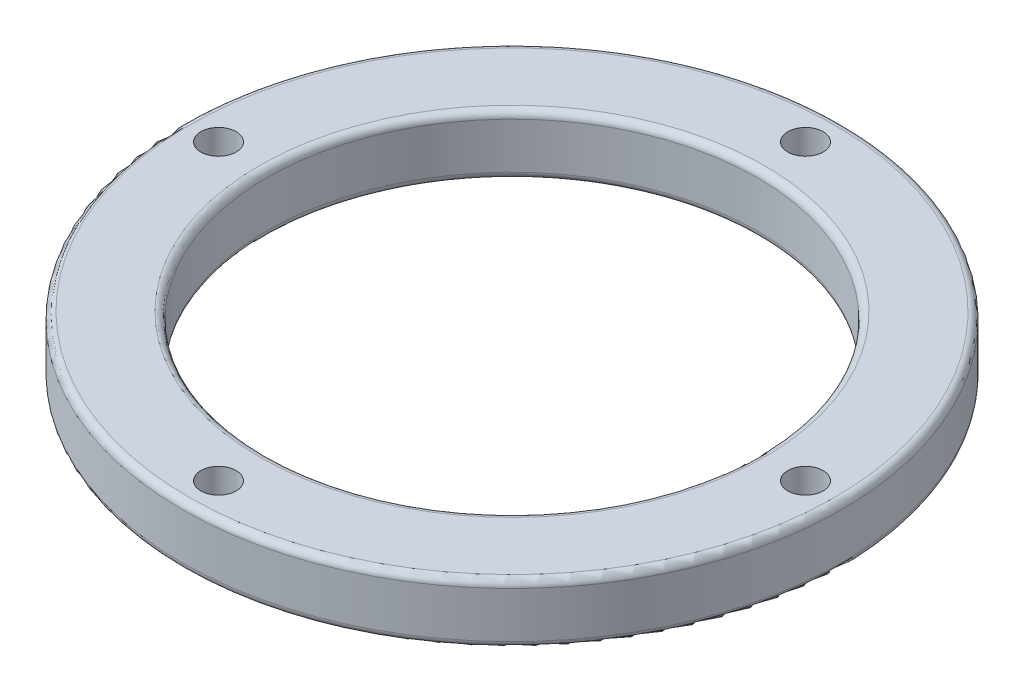
ISO-10303-21;
HEADER;
FILE_DESCRIPTION(('STEP AP214'),'2;1');
FILE_NAME('part.step','',(''),(''),'','','');
FILE_SCHEMA(('AUTOMOTIVE_DESIGN { 1 0 10303 214 1 1 1 1 }'));
ENDSEC;
DATA;
#1=APPLICATION_CONTEXT('core data for automotive mechanical design processes');
#2=APPLICATION_PROTOCOL_DEFINITION('international standard','automotive_design',2000,#1);
#3=PRODUCT_CONTEXT('',#1,'mechanical');
#4=PRODUCT('Part','Part','',(#3));
#5=PRODUCT_RELATED_PRODUCT_CATEGORY('part','',(#4));
#6=PRODUCT_DEFINITION_FORMATION('','',#4);
#7=PRODUCT_DEFINITION_CONTEXT('part definition',#1,'design');
#8=PRODUCT_DEFINITION('design','',#6,#7);
#9=PRODUCT_DEFINITION_SHAPE('','',#8);
#10=(LENGTH_UNIT() NAMED_UNIT(*) SI_UNIT(.MILLI.,.METRE.));
#11=(NAMED_UNIT(*) PLANE_ANGLE_UNIT() SI_UNIT($,.RADIAN.));
#12=(NAMED_UNIT(*) SI_UNIT($,.STERADIAN.) SOLID_ANGLE_UNIT());
#13=UNCERTAINTY_MEASURE_WITH_UNIT(LENGTH_MEASURE(1.E-05),#10,'distance_accuracy_value','');
#14=(GEOMETRIC_REPRESENTATION_CONTEXT(3) GLOBAL_UNCERTAINTY_ASSIGNED_CONTEXT((#13)) GLOBAL_UNIT_ASSIGNED_CONTEXT((#10,
#11,#12)) REPRESENTATION_CONTEXT('',''));
#15=CARTESIAN_POINT('',(0.,0.,0.));
#16=DIRECTION('',(0.,0.,1.));
#17=DIRECTION('',(1.,0.,0.));
#18=AXIS2_PLACEMENT_3D('',#15,#16,#17);
#19=CARTESIAN_POINT('',(0.,8.5,0.));
#20=DIRECTION('',(0.,1.,0.));
#21=DIRECTION('',(0.,0.,1.));
#22=AXIS2_PLACEMENT_3D('',#19,#20,#21);
#23=PLANE('',#22);
#24=CARTESIAN_POINT('',(0.,8.5,0.));
#25=DIRECTION('',(0.,1.,0.));
#26=DIRECTION('',(0.,0.,1.));
#27=AXIS2_PLACEMENT_3D('',#24,#25,#26);
#28=CIRCLE('',#27,45.6);
#29=CARTESIAN_POINT('',(0.,8.5,45.6));
#30=VERTEX_POINT('',#29);
#31=EDGE_CURVE('E41',#30,#30,#28,.T.);
#32=ORIENTED_EDGE('',*,*,#31,.T.);
#33=EDGE_LOOP('',(#32));
#34=FACE_BOUND('',#33,.T.);
#35=CARTESIAN_POINT('',(0.,8.5,0.));
#36=DIRECTION('',(0.,1.,0.));
#37=DIRECTION('',(0.,0.,1.));
#38=AXIS2_PLACEMENT_3D('',#35,#36,#37);
#39=CIRCLE('',#38,35.7);
#40=CARTESIAN_POINT('',(0.,8.5,35.7));
#41=VERTEX_POINT('',#40);
#42=EDGE_CURVE('E45',#41,#41,#39,.F.);
#43=ORIENTED_EDGE('',*,*,#42,.T.);
#44=EDGE_LOOP('',(#43));
#45=FACE_BOUND('',#44,.T.);
#46=CARTESIAN_POINT('',(0.,8.5,41.5));
#47=DIRECTION('',(0.,1.,0.));
#48=DIRECTION('',(0.,0.,1.));
#49=AXIS2_PLACEMENT_3D('',#46,#47,#48);
#50=CIRCLE('',#49,2.5);
#51=CARTESIAN_POINT('',(0.,8.5,44.));
#52=VERTEX_POINT('',#51);
#53=EDGE_CURVE('E72',#52,#52,#50,.T.);
#54=ORIENTED_EDGE('',*,*,#53,.F.);
#55=EDGE_LOOP('',(#54));
#56=FACE_BOUND('',#55,.T.);
#57=CARTESIAN_POINT('',(0.,8.5,-41.5));
#58=DIRECTION('',(0.,1.,0.));
#59=DIRECTION('',(0.,0.,1.));
#60=AXIS2_PLACEMENT_3D('',#57,#58,#59);
#61=CIRCLE('',#60,2.5);
#62=CARTESIAN_POINT('',(0.,8.5,-39.));
#63=VERTEX_POINT('',#62);
#64=EDGE_CURVE('E62',#63,#63,#61,.T.);
#65=ORIENTED_EDGE('',*,*,#64,.F.);
#66=EDGE_LOOP('',(#65));
#67=FACE_BOUND('',#66,.T.);
#68=CARTESIAN_POINT('',(41.5,8.5,0.));
#69=DIRECTION('',(0.,1.,0.));
#70=DIRECTION('',(0.,0.,1.));
#71=AXIS2_PLACEMENT_3D('',#68,#69,#70);
#72=CIRCLE('',#71,2.50000000000015);
#73=CARTESIAN_POINT('',(41.5,8.5,2.50000000000014));
#74=VERTEX_POINT('',#73);
#75=EDGE_CURVE('E66',#74,#74,#72,.T.);
#76=ORIENTED_EDGE('',*,*,#75,.F.);
#77=EDGE_LOOP('',(#76));
#78=FACE_BOUND('',#77,.T.);
#79=CARTESIAN_POINT('',(-41.5,8.5,0.));
#80=DIRECTION('',(0.,1.,0.));
#81=DIRECTION('',(0.,0.,1.));
#82=AXIS2_PLACEMENT_3D('',#79,#80,#81);
#83=CIRCLE('',#82,2.5);
#84=CARTESIAN_POINT('',(-41.5,8.5,2.5));
#85=VERTEX_POINT('',#84);
#86=EDGE_CURVE('E78',#85,#85,#83,.T.);
#87=ORIENTED_EDGE('',*,*,#86,.F.);
#88=EDGE_LOOP('',(#87));
#89=FACE_BOUND('',#88,.T.);
#90=ADVANCED_FACE('F30',(#34,#45,#56,#67,#78,#89),#23,.T.);
#91=CARTESIAN_POINT('',(0.,0.,0.));
#92=DIRECTION('',(0.,1.,0.));
#93=DIRECTION('',(0.,0.,1.));
#94=AXIS2_PLACEMENT_3D('',#91,#92,#93);
#95=PLANE('',#94);
#96=CARTESIAN_POINT('',(0.,0.,0.));
#97=DIRECTION('',(0.,1.,0.));
#98=DIRECTION('',(0.,0.,1.));
#99=AXIS2_PLACEMENT_3D('',#96,#97,#98);
#100=CIRCLE('',#99,45.6);
#101=CARTESIAN_POINT('',(0.,0.,45.6));
#102=VERTEX_POINT('',#101);
#103=EDGE_CURVE('E50',#102,#102,#100,.F.);
#104=ORIENTED_EDGE('',*,*,#103,.T.);
#105=EDGE_LOOP('',(#104));
#106=FACE_BOUND('',#105,.T.);
#107=CARTESIAN_POINT('',(0.,0.,0.));
#108=DIRECTION('',(0.,1.,0.));
#109=DIRECTION('',(0.,0.,1.));
#110=AXIS2_PLACEMENT_3D('',#107,#108,#109);
#111=CIRCLE('',#110,35.7);
#112=CARTESIAN_POINT('',(0.,0.,35.7));
#113=VERTEX_POINT('',#112);
#114=EDGE_CURVE('E53',#113,#113,#111,.T.);
#115=ORIENTED_EDGE('',*,*,#114,.T.);
#116=EDGE_LOOP('',(#115));
#117=FACE_BOUND('',#116,.T.);
#118=CARTESIAN_POINT('',(0.,0.,-41.5));
#119=DIRECTION('',(0.,1.,0.));
#120=DIRECTION('',(0.,0.,1.));
#121=AXIS2_PLACEMENT_3D('',#118,#119,#120);
#122=CIRCLE('',#121,2.5);
#123=CARTESIAN_POINT('',(0.,0.,-39.));
#124=VERTEX_POINT('',#123);
#125=EDGE_CURVE('E63',#124,#124,#122,.T.);
#126=ORIENTED_EDGE('',*,*,#125,.T.);
#127=EDGE_LOOP('',(#126));
#128=FACE_BOUND('',#127,.T.);
#129=CARTESIAN_POINT('',(41.5,0.,0.));
#130=DIRECTION('',(0.,1.,0.));
#131=DIRECTION('',(0.,0.,1.));
#132=AXIS2_PLACEMENT_3D('',#129,#130,#131);
#133=CIRCLE('',#132,2.50000000000015);
#134=CARTESIAN_POINT('',(41.5,0.,2.50000000000014));
#135=VERTEX_POINT('',#134);
#136=EDGE_CURVE('E69',#135,#135,#133,.T.);
#137=ORIENTED_EDGE('',*,*,#136,.T.);
#138=EDGE_LOOP('',(#137));
#139=FACE_BOUND('',#138,.T.);
#140=CARTESIAN_POINT('',(0.,0.,41.5));
#141=DIRECTION('',(0.,1.,0.));
#142=DIRECTION('',(0.,0.,1.));
#143=AXIS2_PLACEMENT_3D('',#140,#141,#142);
#144=CIRCLE('',#143,2.5);
#145=CARTESIAN_POINT('',(0.,0.,44.));
#146=VERTEX_POINT('',#145);
#147=EDGE_CURVE('E75',#146,#146,#144,.T.);
#148=ORIENTED_EDGE('',*,*,#147,.T.);
#149=EDGE_LOOP('',(#148));
#150=FACE_BOUND('',#149,.T.);
#151=CARTESIAN_POINT('',(-41.5,0.,0.));
#152=DIRECTION('',(0.,1.,0.));
#153=DIRECTION('',(0.,0.,1.));
#154=AXIS2_PLACEMENT_3D('',#151,#152,#153);
#155=CIRCLE('',#154,2.5);
#156=CARTESIAN_POINT('',(-41.5,0.,2.5));
#157=VERTEX_POINT('',#156);
#158=EDGE_CURVE('E81',#157,#157,#155,.T.);
#159=ORIENTED_EDGE('',*,*,#158,.T.);
#160=EDGE_LOOP('',(#159));
#161=FACE_BOUND('',#160,.T.);
#162=ADVANCED_FACE('F91',(#106,#117,#128,#139,#150,#161),#95,.F.);
#163=CARTESIAN_POINT('',(0.,8.5,0.));
#164=DIRECTION('',(0.,-1.,0.));
#165=DIRECTION('',(0.,0.,-1.));
#166=AXIS2_PLACEMENT_3D('',#163,#164,#165);
#167=CYLINDRICAL_SURFACE('',#166,46.6);
#168=CARTESIAN_POINT('',(0.,1.,0.));
#169=DIRECTION('',(0.,1.,0.));
#170=DIRECTION('',(0.,0.,1.));
#171=AXIS2_PLACEMENT_3D('',#168,#169,#170);
#172=CIRCLE('',#171,46.6);
#173=CARTESIAN_POINT('',(0.,1.,46.6));
#174=VERTEX_POINT('',#173);
#175=EDGE_CURVE('E56',#174,#174,#172,.T.);
#176=ORIENTED_EDGE('',*,*,#175,.T.);
#177=EDGE_LOOP('',(#176));
#178=FACE_BOUND('',#177,.T.);
#179=CARTESIAN_POINT('',(0.,7.5,0.));
#180=DIRECTION('',(0.,1.,0.));
#181=DIRECTION('',(0.,0.,1.));
#182=AXIS2_PLACEMENT_3D('',#179,#180,#181);
#183=CIRCLE('',#182,46.6);
#184=CARTESIAN_POINT('',(0.,7.5,46.6));
#185=VERTEX_POINT('',#184);
#186=EDGE_CURVE('E59',#185,#185,#183,.F.);
#187=ORIENTED_EDGE('',*,*,#186,.T.);
#188=EDGE_LOOP('',(#187));
#189=FACE_BOUND('',#188,.T.);
#190=ADVANCED_FACE('F97',(#178,#189),#167,.T.);
#191=CARTESIAN_POINT('',(0.,8.5,0.));
#192=DIRECTION('',(0.,-1.,0.));
#193=DIRECTION('',(0.,0.,-1.));
#194=AXIS2_PLACEMENT_3D('',#191,#192,#193);
#195=CYLINDRICAL_SURFACE('',#194,34.7);
#196=CARTESIAN_POINT('',(0.,1.,0.));
#197=DIRECTION('',(0.,1.,0.));
#198=DIRECTION('',(0.,0.,1.));
#199=AXIS2_PLACEMENT_3D('',#196,#197,#198);
#200=CIRCLE('',#199,34.7);
#201=CARTESIAN_POINT('',(0.,1.,34.7));
#202=VERTEX_POINT('',#201);
#203=EDGE_CURVE('E10',#202,#202,#200,.F.);
#204=ORIENTED_EDGE('',*,*,#203,.T.);
#205=EDGE_LOOP('',(#204));
#206=FACE_BOUND('',#205,.T.);
#207=CARTESIAN_POINT('',(0.,7.5,0.));
#208=DIRECTION('',(0.,1.,0.));
#209=DIRECTION('',(0.,0.,1.));
#210=AXIS2_PLACEMENT_3D('',#207,#208,#209);
#211=CIRCLE('',#210,34.7);
#212=CARTESIAN_POINT('',(0.,7.5,34.7));
#213=VERTEX_POINT('',#212);
#214=EDGE_CURVE('E37',#213,#213,#211,.T.);
#215=ORIENTED_EDGE('',*,*,#214,.T.);
#216=EDGE_LOOP('',(#215));
#217=FACE_BOUND('',#216,.T.);
#218=ADVANCED_FACE('F102',(#206,#217),#195,.F.);
#219=CARTESIAN_POINT('',(0.,8.5,-41.5));
#220=DIRECTION('',(0.,-1.,0.));
#221=DIRECTION('',(0.,0.,-1.));
#222=AXIS2_PLACEMENT_3D('',#219,#220,#221);
#223=CYLINDRICAL_SURFACE('',#222,2.5);
#224=ORIENTED_EDGE('',*,*,#64,.T.);
#225=EDGE_LOOP('',(#224));
#226=FACE_BOUND('',#225,.T.);
#227=ORIENTED_EDGE('',*,*,#125,.F.);
#228=EDGE_LOOP('',(#227));
#229=FACE_BOUND('',#228,.T.);
#230=ADVANCED_FACE('F144',(#226,#229),#223,.F.);
#231=CARTESIAN_POINT('',(41.5,8.5,0.));
#232=DIRECTION('',(0.,-1.,0.));
#233=DIRECTION('',(0.,0.,-1.));
#234=AXIS2_PLACEMENT_3D('',#231,#232,#233);
#235=CYLINDRICAL_SURFACE('',#234,2.50000000000015);
#236=ORIENTED_EDGE('',*,*,#75,.T.);
#237=EDGE_LOOP('',(#236));
#238=FACE_BOUND('',#237,.T.);
#239=ORIENTED_EDGE('',*,*,#136,.F.);
#240=EDGE_LOOP('',(#239));
#241=FACE_BOUND('',#240,.T.);
#242=ADVANCED_FACE('F139',(#238,#241),#235,.F.);
#243=CARTESIAN_POINT('',(0.,8.5,41.5));
#244=DIRECTION('',(0.,-1.,0.));
#245=DIRECTION('',(0.,0.,-1.));
#246=AXIS2_PLACEMENT_3D('',#243,#244,#245);
#247=CYLINDRICAL_SURFACE('',#246,2.5);
#248=ORIENTED_EDGE('',*,*,#53,.T.);
#249=EDGE_LOOP('',(#248));
#250=FACE_BOUND('',#249,.T.);
#251=ORIENTED_EDGE('',*,*,#147,.F.);
#252=EDGE_LOOP('',(#251));
#253=FACE_BOUND('',#252,.T.);
#254=ADVANCED_FACE('F134',(#250,#253),#247,.F.);
#255=CARTESIAN_POINT('',(-41.5,8.5,0.));
#256=DIRECTION('',(0.,-1.,0.));
#257=DIRECTION('',(0.,0.,-1.));
#258=AXIS2_PLACEMENT_3D('',#255,#256,#257);
#259=CYLINDRICAL_SURFACE('',#258,2.5);
#260=ORIENTED_EDGE('',*,*,#86,.T.);
#261=EDGE_LOOP('',(#260));
#262=FACE_BOUND('',#261,.T.);
#263=ORIENTED_EDGE('',*,*,#158,.F.);
#264=EDGE_LOOP('',(#263));
#265=FACE_BOUND('',#264,.T.);
#266=ADVANCED_FACE('F87',(#262,#265),#259,.F.);
#267=CARTESIAN_POINT('',(0.,1.,0.));
#268=DIRECTION('',(0.,1.,0.));
#269=DIRECTION('',(0.,0.,1.));
#270=AXIS2_PLACEMENT_3D('',#267,#268,#269);
#271=TOROIDAL_SURFACE('',#270,45.6,1.);
#272=ORIENTED_EDGE('',*,*,#103,.F.);
#273=EDGE_LOOP('',(#272));
#274=FACE_BOUND('',#273,.T.);
#275=ORIENTED_EDGE('',*,*,#175,.F.);
#276=EDGE_LOOP('',(#275));
#277=FACE_BOUND('',#276,.T.);
#278=ADVANCED_FACE('F108',(#274,#277),#271,.T.);
#279=CARTESIAN_POINT('',(0.,7.5,0.));
#280=DIRECTION('',(0.,1.,0.));
#281=DIRECTION('',(0.,0.,1.));
#282=AXIS2_PLACEMENT_3D('',#279,#280,#281);
#283=TOROIDAL_SURFACE('',#282,45.6,1.);
#284=ORIENTED_EDGE('',*,*,#186,.F.);
#285=EDGE_LOOP('',(#284));
#286=FACE_BOUND('',#285,.T.);
#287=ORIENTED_EDGE('',*,*,#31,.F.);
#288=EDGE_LOOP('',(#287));
#289=FACE_BOUND('',#288,.T.);
#290=ADVANCED_FACE('F111',(#286,#289),#283,.T.);
#291=CARTESIAN_POINT('',(0.,1.,0.));
#292=DIRECTION('',(0.,1.,0.));
#293=DIRECTION('',(0.,0.,1.));
#294=AXIS2_PLACEMENT_3D('',#291,#292,#293);
#295=TOROIDAL_SURFACE('',#294,35.7,1.);
#296=ORIENTED_EDGE('',*,*,#203,.F.);
#297=EDGE_LOOP('',(#296));
#298=FACE_BOUND('',#297,.T.);
#299=ORIENTED_EDGE('',*,*,#114,.F.);
#300=EDGE_LOOP('',(#299));
#301=FACE_BOUND('',#300,.T.);
#302=ADVANCED_FACE('F114',(#298,#301),#295,.T.);
#303=CARTESIAN_POINT('',(0.,7.5,0.));
#304=DIRECTION('',(0.,1.,0.));
#305=DIRECTION('',(0.,0.,1.));
#306=AXIS2_PLACEMENT_3D('',#303,#304,#305);
#307=TOROIDAL_SURFACE('',#306,35.7,1.);
#308=ORIENTED_EDGE('',*,*,#42,.F.);
#309=EDGE_LOOP('',(#308));
#310=FACE_BOUND('',#309,.T.);
#311=ORIENTED_EDGE('',*,*,#214,.F.);
#312=EDGE_LOOP('',(#311));
#313=FACE_BOUND('',#312,.T.);
#314=ADVANCED_FACE('F32',(#310,#313),#307,.T.);
#315=CLOSED_SHELL('',(#90,#162,#190,#218,#230,#242,#254,#266,#278,#290,#302,#314));
#316=MANIFOLD_SOLID_BREP('B2',#315);
#317=ADVANCED_BREP_SHAPE_REPRESENTATION('',(#18,#316),#14);
#318=SHAPE_DEFINITION_REPRESENTATION(#9,#317);
ENDSEC;
END-ISO-10303-21;
